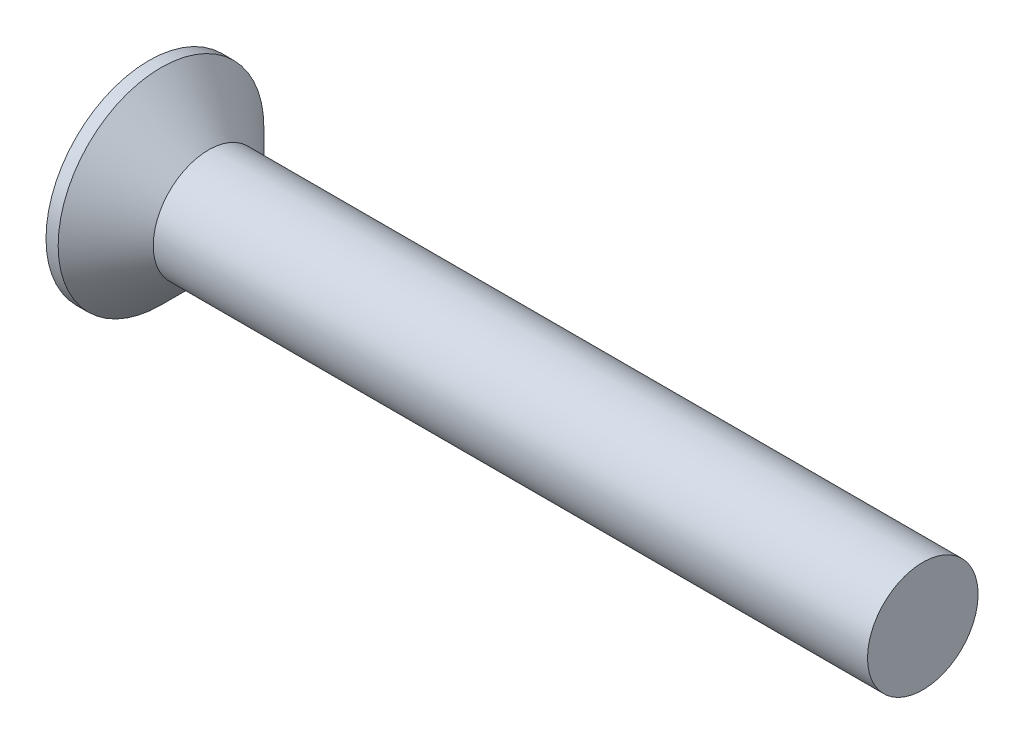
ISO-10303-21;
HEADER;
FILE_DESCRIPTION(('STEP AP214'),'2;1');
FILE_NAME('part.step','',(''),(''),'','','');
FILE_SCHEMA(('AUTOMOTIVE_DESIGN { 1 0 10303 214 1 1 1 1 }'));
ENDSEC;
DATA;
#1=APPLICATION_CONTEXT('core data for automotive mechanical design processes');
#2=APPLICATION_PROTOCOL_DEFINITION('international standard','automotive_design',2000,#1);
#3=PRODUCT_CONTEXT('',#1,'mechanical');
#4=PRODUCT('Part','Part','',(#3));
#5=PRODUCT_RELATED_PRODUCT_CATEGORY('part','',(#4));
#6=PRODUCT_DEFINITION_FORMATION('','',#4);
#7=PRODUCT_DEFINITION_CONTEXT('part definition',#1,'design');
#8=PRODUCT_DEFINITION('design','',#6,#7);
#9=PRODUCT_DEFINITION_SHAPE('','',#8);
#10=(LENGTH_UNIT() NAMED_UNIT(*) SI_UNIT(.MILLI.,.METRE.));
#11=(NAMED_UNIT(*) PLANE_ANGLE_UNIT() SI_UNIT($,.RADIAN.));
#12=(NAMED_UNIT(*) SI_UNIT($,.STERADIAN.) SOLID_ANGLE_UNIT());
#13=UNCERTAINTY_MEASURE_WITH_UNIT(LENGTH_MEASURE(1.E-05),#10,'distance_accuracy_value','');
#14=(GEOMETRIC_REPRESENTATION_CONTEXT(3) GLOBAL_UNCERTAINTY_ASSIGNED_CONTEXT((#13)) GLOBAL_UNIT_ASSIGNED_CONTEXT((#10,
#11,#12)) REPRESENTATION_CONTEXT('',''));
#15=CARTESIAN_POINT('',(0.,0.,0.));
#16=DIRECTION('',(0.,0.,1.));
#17=DIRECTION('',(1.,0.,0.));
#18=AXIS2_PLACEMENT_3D('',#15,#16,#17);
#19=CARTESIAN_POINT('',(0.,4.65,0.));
#20=DIRECTION('',(1.,0.,0.));
#21=DIRECTION('',(0.,0.,-1.));
#22=AXIS2_PLACEMENT_3D('',#19,#20,#21);
#23=PLANE('',#22);
#24=CARTESIAN_POINT('',(0.,0.,0.));
#25=DIRECTION('',(-1.,0.,0.));
#26=DIRECTION('',(0.,0.,1.));
#27=AXIS2_PLACEMENT_3D('',#24,#25,#26);
#28=CIRCLE('',#27,4.65);
#29=CARTESIAN_POINT('',(0.,0.,4.65));
#30=VERTEX_POINT('',#29);
#31=EDGE_CURVE('E44',#30,#30,#28,.T.);
#32=ORIENTED_EDGE('',*,*,#31,.T.);
#33=EDGE_LOOP('',(#32));
#34=FACE_BOUND('',#33,.T.);
#35=ADVANCED_FACE('F30',(#34),#23,.F.);
#36=CARTESIAN_POINT('',(35.,0.,0.));
#37=DIRECTION('',(-1.,0.,0.));
#38=DIRECTION('',(0.,0.,1.));
#39=AXIS2_PLACEMENT_3D('',#36,#37,#38);
#40=PLANE('',#39);
#41=CARTESIAN_POINT('',(35.,0.,0.));
#42=DIRECTION('',(-1.,0.,0.));
#43=DIRECTION('',(0.,0.,1.));
#44=AXIS2_PLACEMENT_3D('',#41,#42,#43);
#45=CIRCLE('',#44,2.5);
#46=CARTESIAN_POINT('',(35.,0.,2.5));
#47=VERTEX_POINT('',#46);
#48=EDGE_CURVE('E10',#47,#47,#45,.T.);
#49=ORIENTED_EDGE('',*,*,#48,.F.);
#50=EDGE_LOOP('',(#49));
#51=FACE_BOUND('',#50,.T.);
#52=ADVANCED_FACE('F64',(#51),#40,.F.);
#53=CARTESIAN_POINT('',(0.,0.,0.));
#54=DIRECTION('',(-1.,0.,0.));
#55=DIRECTION('',(0.,0.,1.));
#56=AXIS2_PLACEMENT_3D('',#53,#54,#55);
#57=CYLINDRICAL_SURFACE('',#56,2.5);
#58=CARTESIAN_POINT('',(2.7,0.,0.));
#59=DIRECTION('',(-1.,0.,0.));
#60=DIRECTION('',(0.,0.,1.));
#61=AXIS2_PLACEMENT_3D('',#58,#59,#60);
#62=CIRCLE('',#61,2.5);
#63=CARTESIAN_POINT('',(2.7,0.,2.5));
#64=VERTEX_POINT('',#63);
#65=EDGE_CURVE('E36',#64,#64,#62,.T.);
#66=ORIENTED_EDGE('',*,*,#65,.F.);
#67=EDGE_LOOP('',(#66));
#68=FACE_BOUND('',#67,.T.);
#69=ORIENTED_EDGE('',*,*,#48,.T.);
#70=EDGE_LOOP('',(#69));
#71=FACE_BOUND('',#70,.T.);
#72=ADVANCED_FACE('F59',(#68,#71),#57,.T.);
#73=CARTESIAN_POINT('',(2.7,0.,0.));
#74=DIRECTION('',(-1.,0.,0.));
#75=DIRECTION('',(0.,0.,1.));
#76=AXIS2_PLACEMENT_3D('',#73,#74,#75);
#77=CONICAL_SURFACE('',#76,2.5,0.78539816339745);
#78=CARTESIAN_POINT('',(0.550000000000004,0.,0.));
#79=DIRECTION('',(-1.,0.,0.));
#80=DIRECTION('',(0.,0.,1.));
#81=AXIS2_PLACEMENT_3D('',#78,#79,#80);
#82=CIRCLE('',#81,4.65);
#83=CARTESIAN_POINT('',(0.550000000000004,0.,4.65));
#84=VERTEX_POINT('',#83);
#85=EDGE_CURVE('E40',#84,#84,#82,.T.);
#86=ORIENTED_EDGE('',*,*,#85,.F.);
#87=EDGE_LOOP('',(#86));
#88=FACE_BOUND('',#87,.T.);
#89=ORIENTED_EDGE('',*,*,#65,.T.);
#90=EDGE_LOOP('',(#89));
#91=FACE_BOUND('',#90,.T.);
#92=ADVANCED_FACE('F54',(#88,#91),#77,.T.);
#93=CARTESIAN_POINT('',(0.,0.,0.));
#94=DIRECTION('',(-1.,0.,0.));
#95=DIRECTION('',(0.,0.,1.));
#96=AXIS2_PLACEMENT_3D('',#93,#94,#95);
#97=CYLINDRICAL_SURFACE('',#96,4.65);
#98=ORIENTED_EDGE('',*,*,#31,.F.);
#99=EDGE_LOOP('',(#98));
#100=FACE_BOUND('',#99,.T.);
#101=ORIENTED_EDGE('',*,*,#85,.T.);
#102=EDGE_LOOP('',(#101));
#103=FACE_BOUND('',#102,.T.);
#104=ADVANCED_FACE('F51',(#100,#103),#97,.T.);
#105=CLOSED_SHELL('',(#35,#52,#72,#92,#104));
#106=MANIFOLD_SOLID_BREP('B2',#105);
#107=ADVANCED_BREP_SHAPE_REPRESENTATION('',(#18,#106),#14);
#108=SHAPE_DEFINITION_REPRESENTATION(#9,#107);
ENDSEC;
END-ISO-10303-21;
